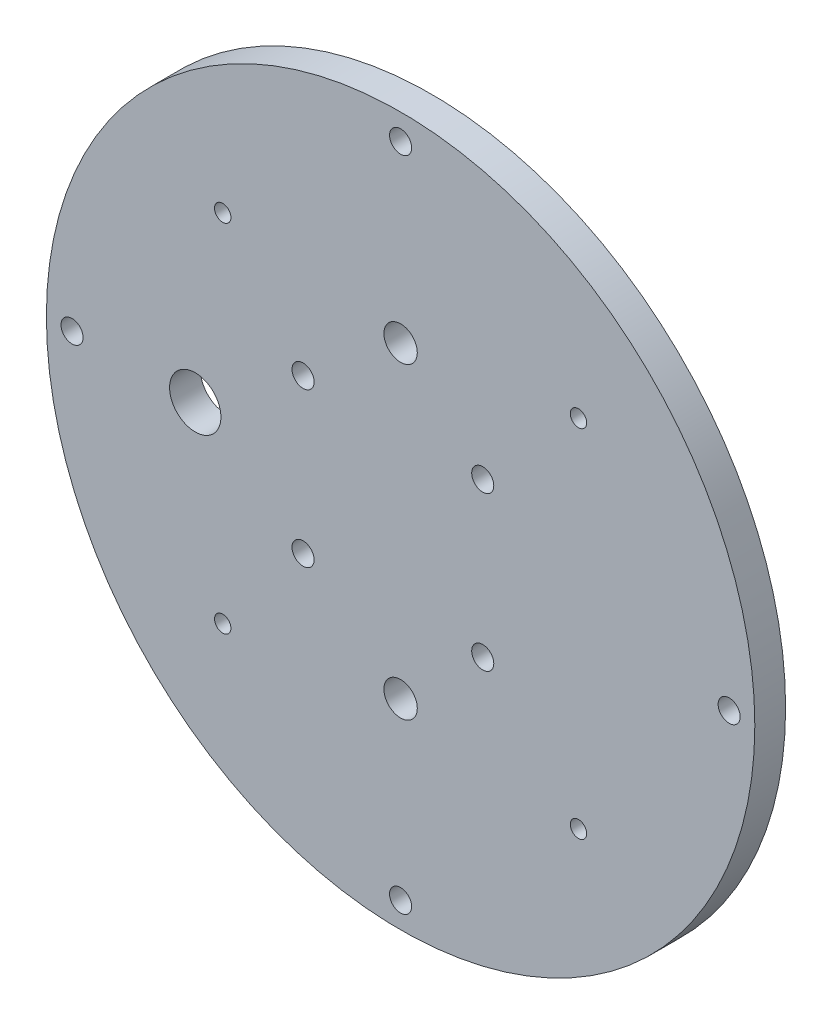
ISO-10303-21;
HEADER;
FILE_DESCRIPTION(('STEP AP214'),'2;1');
FILE_NAME('part.step','',(''),(''),'','','');
FILE_SCHEMA(('AUTOMOTIVE_DESIGN { 1 0 10303 214 1 1 1 1 }'));
ENDSEC;
DATA;
#1=APPLICATION_CONTEXT('core data for automotive mechanical design processes');
#2=APPLICATION_PROTOCOL_DEFINITION('international standard','automotive_design',2000,#1);
#3=PRODUCT_CONTEXT('',#1,'mechanical');
#4=PRODUCT('Part','Part','',(#3));
#5=PRODUCT_RELATED_PRODUCT_CATEGORY('part','',(#4));
#6=PRODUCT_DEFINITION_FORMATION('','',#4);
#7=PRODUCT_DEFINITION_CONTEXT('part definition',#1,'design');
#8=PRODUCT_DEFINITION('design','',#6,#7);
#9=PRODUCT_DEFINITION_SHAPE('','',#8);
#10=(LENGTH_UNIT() NAMED_UNIT(*) SI_UNIT(.MILLI.,.METRE.));
#11=(NAMED_UNIT(*) PLANE_ANGLE_UNIT() SI_UNIT($,.RADIAN.));
#12=(NAMED_UNIT(*) SI_UNIT($,.STERADIAN.) SOLID_ANGLE_UNIT());
#13=UNCERTAINTY_MEASURE_WITH_UNIT(LENGTH_MEASURE(1.E-05),#10,'distance_accuracy_value','');
#14=(GEOMETRIC_REPRESENTATION_CONTEXT(3) GLOBAL_UNCERTAINTY_ASSIGNED_CONTEXT((#13)) GLOBAL_UNIT_ASSIGNED_CONTEXT((#10,
#11,#12)) REPRESENTATION_CONTEXT('',''));
#15=CARTESIAN_POINT('',(0.,0.,0.));
#16=DIRECTION('',(0.,0.,1.));
#17=DIRECTION('',(1.,0.,0.));
#18=AXIS2_PLACEMENT_3D('',#15,#16,#17);
#19=CARTESIAN_POINT('',(0.,0.,6.));
#20=DIRECTION('',(0.,0.,1.));
#21=DIRECTION('',(1.,0.,0.));
#22=AXIS2_PLACEMENT_3D('',#19,#20,#21);
#23=PLANE('',#22);
#24=CARTESIAN_POINT('',(0.,-30.,6.));
#25=DIRECTION('',(0.,0.,1.));
#26=DIRECTION('',(1.,0.,0.));
#27=AXIS2_PLACEMENT_3D('',#24,#25,#26);
#28=CIRCLE('',#27,3.25);
#29=CARTESIAN_POINT('',(3.25,-30.,6.));
#30=VERTEX_POINT('',#29);
#31=EDGE_CURVE('E119',#30,#30,#28,.T.);
#32=ORIENTED_EDGE('',*,*,#31,.F.);
#33=EDGE_LOOP('',(#32));
#34=FACE_BOUND('',#33,.T.);
#35=CARTESIAN_POINT('',(16.,-15.,6.));
#36=DIRECTION('',(0.,0.,1.));
#37=DIRECTION('',(1.,0.,0.));
#38=AXIS2_PLACEMENT_3D('',#35,#36,#37);
#39=CIRCLE('',#38,2.15);
#40=CARTESIAN_POINT('',(18.15,-15.,6.));
#41=VERTEX_POINT('',#40);
#42=EDGE_CURVE('E107',#41,#41,#39,.T.);
#43=ORIENTED_EDGE('',*,*,#42,.F.);
#44=EDGE_LOOP('',(#43));
#45=FACE_BOUND('',#44,.T.);
#46=CARTESIAN_POINT('',(-19.,-15.,6.));
#47=DIRECTION('',(0.,0.,1.));
#48=DIRECTION('',(1.,0.,0.));
#49=AXIS2_PLACEMENT_3D('',#46,#47,#48);
#50=CIRCLE('',#49,2.15);
#51=CARTESIAN_POINT('',(-16.85,-15.,6.));
#52=VERTEX_POINT('',#51);
#53=EDGE_CURVE('E95',#52,#52,#50,.T.);
#54=ORIENTED_EDGE('',*,*,#53,.F.);
#55=EDGE_LOOP('',(#54));
#56=FACE_BOUND('',#55,.T.);
#57=CARTESIAN_POINT('',(0.,-64.,6.));
#58=DIRECTION('',(0.,0.,1.));
#59=DIRECTION('',(1.,0.,0.));
#60=AXIS2_PLACEMENT_3D('',#57,#58,#59);
#61=CIRCLE('',#60,2.15);
#62=CARTESIAN_POINT('',(2.14999999999999,-64.,6.));
#63=VERTEX_POINT('',#62);
#64=EDGE_CURVE('E83',#63,#63,#61,.T.);
#65=ORIENTED_EDGE('',*,*,#64,.F.);
#66=EDGE_LOOP('',(#65));
#67=FACE_BOUND('',#66,.T.);
#68=CARTESIAN_POINT('',(0.,64.,6.));
#69=DIRECTION('',(0.,0.,1.));
#70=DIRECTION('',(1.,0.,0.));
#71=AXIS2_PLACEMENT_3D('',#68,#69,#70);
#72=CIRCLE('',#71,2.15);
#73=CARTESIAN_POINT('',(2.15,64.,6.));
#74=VERTEX_POINT('',#73);
#75=EDGE_CURVE('E71',#74,#74,#72,.T.);
#76=ORIENTED_EDGE('',*,*,#75,.F.);
#77=EDGE_LOOP('',(#76));
#78=FACE_BOUND('',#77,.T.);
#79=CARTESIAN_POINT('',(34.6482322781408,-34.6482322781408,6.));
#80=DIRECTION('',(0.,0.,1.));
#81=DIRECTION('',(1.,0.,0.));
#82=AXIS2_PLACEMENT_3D('',#79,#80,#81);
#83=CIRCLE('',#82,1.6);
#84=CARTESIAN_POINT('',(36.2482322781408,-34.6482322781408,6.));
#85=VERTEX_POINT('',#84);
#86=EDGE_CURVE('E59',#85,#85,#83,.T.);
#87=ORIENTED_EDGE('',*,*,#86,.F.);
#88=EDGE_LOOP('',(#87));
#89=FACE_BOUND('',#88,.T.);
#90=CARTESIAN_POINT('',(-34.6482322781408,34.6482322781408,6.));
#91=DIRECTION('',(0.,0.,1.));
#92=DIRECTION('',(1.,0.,0.));
#93=AXIS2_PLACEMENT_3D('',#90,#91,#92);
#94=CIRCLE('',#93,1.6);
#95=CARTESIAN_POINT('',(-33.0482322781408,34.6482322781408,6.));
#96=VERTEX_POINT('',#95);
#97=EDGE_CURVE('E47',#96,#96,#94,.T.);
#98=ORIENTED_EDGE('',*,*,#97,.F.);
#99=EDGE_LOOP('',(#98));
#100=FACE_BOUND('',#99,.T.);
#101=CARTESIAN_POINT('',(0.,0.,6.));
#102=DIRECTION('',(0.,0.,1.));
#103=DIRECTION('',(1.,0.,0.));
#104=AXIS2_PLACEMENT_3D('',#101,#102,#103);
#105=CIRCLE('',#104,69.);
#106=CARTESIAN_POINT('',(69.,0.,6.));
#107=VERTEX_POINT('',#106);
#108=EDGE_CURVE('E10',#107,#107,#105,.T.);
#109=ORIENTED_EDGE('',*,*,#108,.T.);
#110=EDGE_LOOP('',(#109));
#111=FACE_BOUND('',#110,.T.);
#112=CARTESIAN_POINT('',(34.6482322781408,34.6482322781408,6.));
#113=DIRECTION('',(0.,0.,1.));
#114=DIRECTION('',(1.,0.,0.));
#115=AXIS2_PLACEMENT_3D('',#112,#113,#114);
#116=CIRCLE('',#115,1.6);
#117=CARTESIAN_POINT('',(36.2482322781408,34.6482322781408,6.));
#118=VERTEX_POINT('',#117);
#119=EDGE_CURVE('E42',#118,#118,#116,.T.);
#120=ORIENTED_EDGE('',*,*,#119,.F.);
#121=EDGE_LOOP('',(#120));
#122=FACE_BOUND('',#121,.T.);
#123=CARTESIAN_POINT('',(-34.6482322781408,-34.6482322781408,6.));
#124=DIRECTION('',(0.,0.,1.));
#125=DIRECTION('',(1.,0.,0.));
#126=AXIS2_PLACEMENT_3D('',#123,#124,#125);
#127=CIRCLE('',#126,1.6);
#128=CARTESIAN_POINT('',(-33.0482322781408,-34.6482322781408,6.));
#129=VERTEX_POINT('',#128);
#130=EDGE_CURVE('E53',#129,#129,#127,.T.);
#131=ORIENTED_EDGE('',*,*,#130,.F.);
#132=EDGE_LOOP('',(#131));
#133=FACE_BOUND('',#132,.T.);
#134=CARTESIAN_POINT('',(64.,0.,6.));
#135=DIRECTION('',(0.,0.,1.));
#136=DIRECTION('',(1.,0.,0.));
#137=AXIS2_PLACEMENT_3D('',#134,#135,#136);
#138=CIRCLE('',#137,2.15);
#139=CARTESIAN_POINT('',(66.15,0.,6.));
#140=VERTEX_POINT('',#139);
#141=EDGE_CURVE('E65',#140,#140,#138,.T.);
#142=ORIENTED_EDGE('',*,*,#141,.F.);
#143=EDGE_LOOP('',(#142));
#144=FACE_BOUND('',#143,.T.);
#145=CARTESIAN_POINT('',(-64.,0.,6.));
#146=DIRECTION('',(0.,0.,1.));
#147=DIRECTION('',(1.,0.,0.));
#148=AXIS2_PLACEMENT_3D('',#145,#146,#147);
#149=CIRCLE('',#148,2.15);
#150=CARTESIAN_POINT('',(-61.85,0.,6.));
#151=VERTEX_POINT('',#150);
#152=EDGE_CURVE('E77',#151,#151,#149,.T.);
#153=ORIENTED_EDGE('',*,*,#152,.F.);
#154=EDGE_LOOP('',(#153));
#155=FACE_BOUND('',#154,.T.);
#156=CARTESIAN_POINT('',(-19.,15.,6.));
#157=DIRECTION('',(0.,0.,1.));
#158=DIRECTION('',(1.,0.,0.));
#159=AXIS2_PLACEMENT_3D('',#156,#157,#158);
#160=CIRCLE('',#159,2.15);
#161=CARTESIAN_POINT('',(-16.85,15.,6.));
#162=VERTEX_POINT('',#161);
#163=EDGE_CURVE('E89',#162,#162,#160,.T.);
#164=ORIENTED_EDGE('',*,*,#163,.F.);
#165=EDGE_LOOP('',(#164));
#166=FACE_BOUND('',#165,.T.);
#167=CARTESIAN_POINT('',(16.,15.,6.));
#168=DIRECTION('',(0.,0.,1.));
#169=DIRECTION('',(1.,0.,0.));
#170=AXIS2_PLACEMENT_3D('',#167,#168,#169);
#171=CIRCLE('',#170,2.15);
#172=CARTESIAN_POINT('',(18.15,15.,6.));
#173=VERTEX_POINT('',#172);
#174=EDGE_CURVE('E101',#173,#173,#171,.T.);
#175=ORIENTED_EDGE('',*,*,#174,.F.);
#176=EDGE_LOOP('',(#175));
#177=FACE_BOUND('',#176,.T.);
#178=CARTESIAN_POINT('',(0.,30.,6.));
#179=DIRECTION('',(0.,0.,1.));
#180=DIRECTION('',(1.,0.,0.));
#181=AXIS2_PLACEMENT_3D('',#178,#179,#180);
#182=CIRCLE('',#181,3.25);
#183=CARTESIAN_POINT('',(3.25,30.,6.));
#184=VERTEX_POINT('',#183);
#185=EDGE_CURVE('E113',#184,#184,#182,.T.);
#186=ORIENTED_EDGE('',*,*,#185,.F.);
#187=EDGE_LOOP('',(#186));
#188=FACE_BOUND('',#187,.T.);
#189=CARTESIAN_POINT('',(-40.,0.,6.));
#190=DIRECTION('',(0.,0.,1.));
#191=DIRECTION('',(1.,0.,0.));
#192=AXIS2_PLACEMENT_3D('',#189,#190,#191);
#193=CIRCLE('',#192,5.);
#194=CARTESIAN_POINT('',(-35.,0.,6.));
#195=VERTEX_POINT('',#194);
#196=EDGE_CURVE('E125',#195,#195,#193,.T.);
#197=ORIENTED_EDGE('',*,*,#196,.F.);
#198=EDGE_LOOP('',(#197));
#199=FACE_BOUND('',#198,.T.);
#200=ADVANCED_FACE('F31',(#34,#45,#56,#67,#78,#89,#100,#111,#122,#133,#144,#155,#166,#177,#188,
#199),#23,.T.);
#201=CARTESIAN_POINT('',(0.,0.,0.));
#202=DIRECTION('',(0.,0.,1.));
#203=DIRECTION('',(1.,0.,0.));
#204=AXIS2_PLACEMENT_3D('',#201,#202,#203);
#205=PLANE('',#204);
#206=CARTESIAN_POINT('',(0.,0.,0.));
#207=DIRECTION('',(0.,0.,1.));
#208=DIRECTION('',(1.,0.,0.));
#209=AXIS2_PLACEMENT_3D('',#206,#207,#208);
#210=CIRCLE('',#209,69.);
#211=CARTESIAN_POINT('',(69.,0.,0.));
#212=VERTEX_POINT('',#211);
#213=EDGE_CURVE('E35',#212,#212,#210,.T.);
#214=ORIENTED_EDGE('',*,*,#213,.F.);
#215=EDGE_LOOP('',(#214));
#216=FACE_BOUND('',#215,.T.);
#217=CARTESIAN_POINT('',(34.6482322781408,34.6482322781408,0.));
#218=DIRECTION('',(0.,0.,1.));
#219=DIRECTION('',(1.,0.,0.));
#220=AXIS2_PLACEMENT_3D('',#217,#218,#219);
#221=CIRCLE('',#220,1.6);
#222=CARTESIAN_POINT('',(36.2482322781408,34.6482322781408,0.));
#223=VERTEX_POINT('',#222);
#224=EDGE_CURVE('E44',#223,#223,#221,.T.);
#225=ORIENTED_EDGE('',*,*,#224,.T.);
#226=EDGE_LOOP('',(#225));
#227=FACE_BOUND('',#226,.T.);
#228=CARTESIAN_POINT('',(-34.6482322781408,34.6482322781408,0.));
#229=DIRECTION('',(0.,0.,1.));
#230=DIRECTION('',(1.,0.,0.));
#231=AXIS2_PLACEMENT_3D('',#228,#229,#230);
#232=CIRCLE('',#231,1.6);
#233=CARTESIAN_POINT('',(-33.0482322781408,34.6482322781408,0.));
#234=VERTEX_POINT('',#233);
#235=EDGE_CURVE('E50',#234,#234,#232,.T.);
#236=ORIENTED_EDGE('',*,*,#235,.T.);
#237=EDGE_LOOP('',(#236));
#238=FACE_BOUND('',#237,.T.);
#239=CARTESIAN_POINT('',(-34.6482322781408,-34.6482322781408,0.));
#240=DIRECTION('',(0.,0.,1.));
#241=DIRECTION('',(1.,0.,0.));
#242=AXIS2_PLACEMENT_3D('',#239,#240,#241);
#243=CIRCLE('',#242,1.6);
#244=CARTESIAN_POINT('',(-33.0482322781408,-34.6482322781408,0.));
#245=VERTEX_POINT('',#244);
#246=EDGE_CURVE('E56',#245,#245,#243,.T.);
#247=ORIENTED_EDGE('',*,*,#246,.T.);
#248=EDGE_LOOP('',(#247));
#249=FACE_BOUND('',#248,.T.);
#250=CARTESIAN_POINT('',(34.6482322781408,-34.6482322781408,0.));
#251=DIRECTION('',(0.,0.,1.));
#252=DIRECTION('',(1.,0.,0.));
#253=AXIS2_PLACEMENT_3D('',#250,#251,#252);
#254=CIRCLE('',#253,1.6);
#255=CARTESIAN_POINT('',(36.2482322781408,-34.6482322781408,0.));
#256=VERTEX_POINT('',#255);
#257=EDGE_CURVE('E62',#256,#256,#254,.T.);
#258=ORIENTED_EDGE('',*,*,#257,.T.);
#259=EDGE_LOOP('',(#258));
#260=FACE_BOUND('',#259,.T.);
#261=CARTESIAN_POINT('',(64.,0.,0.));
#262=DIRECTION('',(0.,0.,1.));
#263=DIRECTION('',(1.,0.,0.));
#264=AXIS2_PLACEMENT_3D('',#261,#262,#263);
#265=CIRCLE('',#264,2.15);
#266=CARTESIAN_POINT('',(66.15,0.,0.));
#267=VERTEX_POINT('',#266);
#268=EDGE_CURVE('E68',#267,#267,#265,.T.);
#269=ORIENTED_EDGE('',*,*,#268,.T.);
#270=EDGE_LOOP('',(#269));
#271=FACE_BOUND('',#270,.T.);
#272=CARTESIAN_POINT('',(0.,64.,0.));
#273=DIRECTION('',(0.,0.,1.));
#274=DIRECTION('',(1.,0.,0.));
#275=AXIS2_PLACEMENT_3D('',#272,#273,#274);
#276=CIRCLE('',#275,2.15);
#277=CARTESIAN_POINT('',(2.15,64.,0.));
#278=VERTEX_POINT('',#277);
#279=EDGE_CURVE('E74',#278,#278,#276,.T.);
#280=ORIENTED_EDGE('',*,*,#279,.T.);
#281=EDGE_LOOP('',(#280));
#282=FACE_BOUND('',#281,.T.);
#283=CARTESIAN_POINT('',(-64.,0.,0.));
#284=DIRECTION('',(0.,0.,1.));
#285=DIRECTION('',(1.,0.,0.));
#286=AXIS2_PLACEMENT_3D('',#283,#284,#285);
#287=CIRCLE('',#286,2.15);
#288=CARTESIAN_POINT('',(-61.85,0.,0.));
#289=VERTEX_POINT('',#288);
#290=EDGE_CURVE('E80',#289,#289,#287,.T.);
#291=ORIENTED_EDGE('',*,*,#290,.T.);
#292=EDGE_LOOP('',(#291));
#293=FACE_BOUND('',#292,.T.);
#294=CARTESIAN_POINT('',(0.,-64.,0.));
#295=DIRECTION('',(0.,0.,1.));
#296=DIRECTION('',(1.,0.,0.));
#297=AXIS2_PLACEMENT_3D('',#294,#295,#296);
#298=CIRCLE('',#297,2.15);
#299=CARTESIAN_POINT('',(2.14999999999999,-64.,0.));
#300=VERTEX_POINT('',#299);
#301=EDGE_CURVE('E86',#300,#300,#298,.T.);
#302=ORIENTED_EDGE('',*,*,#301,.T.);
#303=EDGE_LOOP('',(#302));
#304=FACE_BOUND('',#303,.T.);
#305=CARTESIAN_POINT('',(-19.,15.,0.));
#306=DIRECTION('',(0.,0.,1.));
#307=DIRECTION('',(1.,0.,0.));
#308=AXIS2_PLACEMENT_3D('',#305,#306,#307);
#309=CIRCLE('',#308,2.15);
#310=CARTESIAN_POINT('',(-16.85,15.,0.));
#311=VERTEX_POINT('',#310);
#312=EDGE_CURVE('E92',#311,#311,#309,.T.);
#313=ORIENTED_EDGE('',*,*,#312,.T.);
#314=EDGE_LOOP('',(#313));
#315=FACE_BOUND('',#314,.T.);
#316=CARTESIAN_POINT('',(-19.,-15.,0.));
#317=DIRECTION('',(0.,0.,1.));
#318=DIRECTION('',(1.,0.,0.));
#319=AXIS2_PLACEMENT_3D('',#316,#317,#318);
#320=CIRCLE('',#319,2.15);
#321=CARTESIAN_POINT('',(-16.85,-15.,0.));
#322=VERTEX_POINT('',#321);
#323=EDGE_CURVE('E98',#322,#322,#320,.T.);
#324=ORIENTED_EDGE('',*,*,#323,.T.);
#325=EDGE_LOOP('',(#324));
#326=FACE_BOUND('',#325,.T.);
#327=CARTESIAN_POINT('',(16.,15.,0.));
#328=DIRECTION('',(0.,0.,1.));
#329=DIRECTION('',(1.,0.,0.));
#330=AXIS2_PLACEMENT_3D('',#327,#328,#329);
#331=CIRCLE('',#330,2.15);
#332=CARTESIAN_POINT('',(18.15,15.,0.));
#333=VERTEX_POINT('',#332);
#334=EDGE_CURVE('E104',#333,#333,#331,.T.);
#335=ORIENTED_EDGE('',*,*,#334,.T.);
#336=EDGE_LOOP('',(#335));
#337=FACE_BOUND('',#336,.T.);
#338=CARTESIAN_POINT('',(16.,-15.,0.));
#339=DIRECTION('',(0.,0.,1.));
#340=DIRECTION('',(1.,0.,0.));
#341=AXIS2_PLACEMENT_3D('',#338,#339,#340);
#342=CIRCLE('',#341,2.15);
#343=CARTESIAN_POINT('',(18.15,-15.,0.));
#344=VERTEX_POINT('',#343);
#345=EDGE_CURVE('E110',#344,#344,#342,.T.);
#346=ORIENTED_EDGE('',*,*,#345,.T.);
#347=EDGE_LOOP('',(#346));
#348=FACE_BOUND('',#347,.T.);
#349=CARTESIAN_POINT('',(0.,30.,0.));
#350=DIRECTION('',(0.,0.,1.));
#351=DIRECTION('',(1.,0.,0.));
#352=AXIS2_PLACEMENT_3D('',#349,#350,#351);
#353=CIRCLE('',#352,3.25);
#354=CARTESIAN_POINT('',(3.25,30.,0.));
#355=VERTEX_POINT('',#354);
#356=EDGE_CURVE('E116',#355,#355,#353,.T.);
#357=ORIENTED_EDGE('',*,*,#356,.T.);
#358=EDGE_LOOP('',(#357));
#359=FACE_BOUND('',#358,.T.);
#360=CARTESIAN_POINT('',(0.,-30.,0.));
#361=DIRECTION('',(0.,0.,1.));
#362=DIRECTION('',(1.,0.,0.));
#363=AXIS2_PLACEMENT_3D('',#360,#361,#362);
#364=CIRCLE('',#363,3.25);
#365=CARTESIAN_POINT('',(3.25,-30.,0.));
#366=VERTEX_POINT('',#365);
#367=EDGE_CURVE('E122',#366,#366,#364,.T.);
#368=ORIENTED_EDGE('',*,*,#367,.T.);
#369=EDGE_LOOP('',(#368));
#370=FACE_BOUND('',#369,.T.);
#371=CARTESIAN_POINT('',(-40.,0.,0.));
#372=DIRECTION('',(0.,0.,1.));
#373=DIRECTION('',(1.,0.,0.));
#374=AXIS2_PLACEMENT_3D('',#371,#372,#373);
#375=CIRCLE('',#374,5.);
#376=CARTESIAN_POINT('',(-35.,0.,0.));
#377=VERTEX_POINT('',#376);
#378=EDGE_CURVE('E128',#377,#377,#375,.T.);
#379=ORIENTED_EDGE('',*,*,#378,.T.);
#380=EDGE_LOOP('',(#379));
#381=FACE_BOUND('',#380,.T.);
#382=ADVANCED_FACE('F138',(#216,#227,#238,#249,#260,#271,#282,#293,#304,#315,#326,#337,#348,
#359,#370,#381),#205,.F.);
#383=CARTESIAN_POINT('',(0.,0.,6.));
#384=DIRECTION('',(0.,0.,-1.));
#385=DIRECTION('',(-1.,0.,0.));
#386=AXIS2_PLACEMENT_3D('',#383,#384,#385);
#387=CYLINDRICAL_SURFACE('',#386,69.);
#388=ORIENTED_EDGE('',*,*,#108,.F.);
#389=EDGE_LOOP('',(#388));
#390=FACE_BOUND('',#389,.T.);
#391=ORIENTED_EDGE('',*,*,#213,.T.);
#392=EDGE_LOOP('',(#391));
#393=FACE_BOUND('',#392,.T.);
#394=ADVANCED_FACE('F33',(#390,#393),#387,.T.);
#395=CARTESIAN_POINT('',(34.6482322781408,34.6482322781408,6.));
#396=DIRECTION('',(0.,0.,-1.));
#397=DIRECTION('',(-1.,0.,0.));
#398=AXIS2_PLACEMENT_3D('',#395,#396,#397);
#399=CYLINDRICAL_SURFACE('',#398,1.6);
#400=ORIENTED_EDGE('',*,*,#119,.T.);
#401=EDGE_LOOP('',(#400));
#402=FACE_BOUND('',#401,.T.);
#403=ORIENTED_EDGE('',*,*,#224,.F.);
#404=EDGE_LOOP('',(#403));
#405=FACE_BOUND('',#404,.T.);
#406=ADVANCED_FACE('F148',(#402,#405),#399,.F.);
#407=CARTESIAN_POINT('',(-34.6482322781408,34.6482322781408,6.));
#408=DIRECTION('',(0.,0.,-1.));
#409=DIRECTION('',(-1.,0.,0.));
#410=AXIS2_PLACEMENT_3D('',#407,#408,#409);
#411=CYLINDRICAL_SURFACE('',#410,1.6);
#412=ORIENTED_EDGE('',*,*,#97,.T.);
#413=EDGE_LOOP('',(#412));
#414=FACE_BOUND('',#413,.T.);
#415=ORIENTED_EDGE('',*,*,#235,.F.);
#416=EDGE_LOOP('',(#415));
#417=FACE_BOUND('',#416,.T.);
#418=ADVANCED_FACE('F151',(#414,#417),#411,.F.);
#419=CARTESIAN_POINT('',(-34.6482322781408,-34.6482322781408,6.));
#420=DIRECTION('',(0.,0.,-1.));
#421=DIRECTION('',(-1.,0.,0.));
#422=AXIS2_PLACEMENT_3D('',#419,#420,#421);
#423=CYLINDRICAL_SURFACE('',#422,1.6);
#424=ORIENTED_EDGE('',*,*,#130,.T.);
#425=EDGE_LOOP('',(#424));
#426=FACE_BOUND('',#425,.T.);
#427=ORIENTED_EDGE('',*,*,#246,.F.);
#428=EDGE_LOOP('',(#427));
#429=FACE_BOUND('',#428,.T.);
#430=ADVANCED_FACE('F155',(#426,#429),#423,.F.);
#431=CARTESIAN_POINT('',(34.6482322781408,-34.6482322781408,6.));
#432=DIRECTION('',(0.,0.,-1.));
#433=DIRECTION('',(-1.,0.,0.));
#434=AXIS2_PLACEMENT_3D('',#431,#432,#433);
#435=CYLINDRICAL_SURFACE('',#434,1.6);
#436=ORIENTED_EDGE('',*,*,#86,.T.);
#437=EDGE_LOOP('',(#436));
#438=FACE_BOUND('',#437,.T.);
#439=ORIENTED_EDGE('',*,*,#257,.F.);
#440=EDGE_LOOP('',(#439));
#441=FACE_BOUND('',#440,.T.);
#442=ADVANCED_FACE('F159',(#438,#441),#435,.F.);
#443=CARTESIAN_POINT('',(64.,0.,6.));
#444=DIRECTION('',(0.,0.,-1.));
#445=DIRECTION('',(-1.,0.,0.));
#446=AXIS2_PLACEMENT_3D('',#443,#444,#445);
#447=CYLINDRICAL_SURFACE('',#446,2.15);
#448=ORIENTED_EDGE('',*,*,#141,.T.);
#449=EDGE_LOOP('',(#448));
#450=FACE_BOUND('',#449,.T.);
#451=ORIENTED_EDGE('',*,*,#268,.F.);
#452=EDGE_LOOP('',(#451));
#453=FACE_BOUND('',#452,.T.);
#454=ADVANCED_FACE('F163',(#450,#453),#447,.F.);
#455=CARTESIAN_POINT('',(0.,64.,6.));
#456=DIRECTION('',(0.,0.,-1.));
#457=DIRECTION('',(-1.,0.,0.));
#458=AXIS2_PLACEMENT_3D('',#455,#456,#457);
#459=CYLINDRICAL_SURFACE('',#458,2.15);
#460=ORIENTED_EDGE('',*,*,#75,.T.);
#461=EDGE_LOOP('',(#460));
#462=FACE_BOUND('',#461,.T.);
#463=ORIENTED_EDGE('',*,*,#279,.F.);
#464=EDGE_LOOP('',(#463));
#465=FACE_BOUND('',#464,.T.);
#466=ADVANCED_FACE('F167',(#462,#465),#459,.F.);
#467=CARTESIAN_POINT('',(-64.,0.,6.));
#468=DIRECTION('',(0.,0.,-1.));
#469=DIRECTION('',(-1.,0.,0.));
#470=AXIS2_PLACEMENT_3D('',#467,#468,#469);
#471=CYLINDRICAL_SURFACE('',#470,2.15);
#472=ORIENTED_EDGE('',*,*,#152,.T.);
#473=EDGE_LOOP('',(#472));
#474=FACE_BOUND('',#473,.T.);
#475=ORIENTED_EDGE('',*,*,#290,.F.);
#476=EDGE_LOOP('',(#475));
#477=FACE_BOUND('',#476,.T.);
#478=ADVANCED_FACE('F171',(#474,#477),#471,.F.);
#479=CARTESIAN_POINT('',(0.,-64.,6.));
#480=DIRECTION('',(0.,0.,-1.));
#481=DIRECTION('',(-1.,0.,0.));
#482=AXIS2_PLACEMENT_3D('',#479,#480,#481);
#483=CYLINDRICAL_SURFACE('',#482,2.15);
#484=ORIENTED_EDGE('',*,*,#64,.T.);
#485=EDGE_LOOP('',(#484));
#486=FACE_BOUND('',#485,.T.);
#487=ORIENTED_EDGE('',*,*,#301,.F.);
#488=EDGE_LOOP('',(#487));
#489=FACE_BOUND('',#488,.T.);
#490=ADVANCED_FACE('F175',(#486,#489),#483,.F.);
#491=CARTESIAN_POINT('',(-19.,15.,6.));
#492=DIRECTION('',(0.,0.,-1.));
#493=DIRECTION('',(-1.,0.,0.));
#494=AXIS2_PLACEMENT_3D('',#491,#492,#493);
#495=CYLINDRICAL_SURFACE('',#494,2.15);
#496=ORIENTED_EDGE('',*,*,#163,.T.);
#497=EDGE_LOOP('',(#496));
#498=FACE_BOUND('',#497,.T.);
#499=ORIENTED_EDGE('',*,*,#312,.F.);
#500=EDGE_LOOP('',(#499));
#501=FACE_BOUND('',#500,.T.);
#502=ADVANCED_FACE('F179',(#498,#501),#495,.F.);
#503=CARTESIAN_POINT('',(-19.,-15.,6.));
#504=DIRECTION('',(0.,0.,-1.));
#505=DIRECTION('',(-1.,0.,0.));
#506=AXIS2_PLACEMENT_3D('',#503,#504,#505);
#507=CYLINDRICAL_SURFACE('',#506,2.15);
#508=ORIENTED_EDGE('',*,*,#53,.T.);
#509=EDGE_LOOP('',(#508));
#510=FACE_BOUND('',#509,.T.);
#511=ORIENTED_EDGE('',*,*,#323,.F.);
#512=EDGE_LOOP('',(#511));
#513=FACE_BOUND('',#512,.T.);
#514=ADVANCED_FACE('F183',(#510,#513),#507,.F.);
#515=CARTESIAN_POINT('',(16.,15.,6.));
#516=DIRECTION('',(0.,0.,-1.));
#517=DIRECTION('',(-1.,0.,0.));
#518=AXIS2_PLACEMENT_3D('',#515,#516,#517);
#519=CYLINDRICAL_SURFACE('',#518,2.15);
#520=ORIENTED_EDGE('',*,*,#174,.T.);
#521=EDGE_LOOP('',(#520));
#522=FACE_BOUND('',#521,.T.);
#523=ORIENTED_EDGE('',*,*,#334,.F.);
#524=EDGE_LOOP('',(#523));
#525=FACE_BOUND('',#524,.T.);
#526=ADVANCED_FACE('F187',(#522,#525),#519,.F.);
#527=CARTESIAN_POINT('',(16.,-15.,6.));
#528=DIRECTION('',(0.,0.,-1.));
#529=DIRECTION('',(-1.,0.,0.));
#530=AXIS2_PLACEMENT_3D('',#527,#528,#529);
#531=CYLINDRICAL_SURFACE('',#530,2.15);
#532=ORIENTED_EDGE('',*,*,#42,.T.);
#533=EDGE_LOOP('',(#532));
#534=FACE_BOUND('',#533,.T.);
#535=ORIENTED_EDGE('',*,*,#345,.F.);
#536=EDGE_LOOP('',(#535));
#537=FACE_BOUND('',#536,.T.);
#538=ADVANCED_FACE('F191',(#534,#537),#531,.F.);
#539=CARTESIAN_POINT('',(0.,30.,6.));
#540=DIRECTION('',(0.,0.,-1.));
#541=DIRECTION('',(-1.,0.,0.));
#542=AXIS2_PLACEMENT_3D('',#539,#540,#541);
#543=CYLINDRICAL_SURFACE('',#542,3.25);
#544=ORIENTED_EDGE('',*,*,#185,.T.);
#545=EDGE_LOOP('',(#544));
#546=FACE_BOUND('',#545,.T.);
#547=ORIENTED_EDGE('',*,*,#356,.F.);
#548=EDGE_LOOP('',(#547));
#549=FACE_BOUND('',#548,.T.);
#550=ADVANCED_FACE('F195',(#546,#549),#543,.F.);
#551=CARTESIAN_POINT('',(0.,-30.,6.));
#552=DIRECTION('',(0.,0.,-1.));
#553=DIRECTION('',(-1.,0.,0.));
#554=AXIS2_PLACEMENT_3D('',#551,#552,#553);
#555=CYLINDRICAL_SURFACE('',#554,3.25);
#556=ORIENTED_EDGE('',*,*,#31,.T.);
#557=EDGE_LOOP('',(#556));
#558=FACE_BOUND('',#557,.T.);
#559=ORIENTED_EDGE('',*,*,#367,.F.);
#560=EDGE_LOOP('',(#559));
#561=FACE_BOUND('',#560,.T.);
#562=ADVANCED_FACE('F199',(#558,#561),#555,.F.);
#563=CARTESIAN_POINT('',(-40.,0.,6.));
#564=DIRECTION('',(0.,0.,-1.));
#565=DIRECTION('',(-1.,0.,0.));
#566=AXIS2_PLACEMENT_3D('',#563,#564,#565);
#567=CYLINDRICAL_SURFACE('',#566,5.);
#568=ORIENTED_EDGE('',*,*,#196,.T.);
#569=EDGE_LOOP('',(#568));
#570=FACE_BOUND('',#569,.T.);
#571=ORIENTED_EDGE('',*,*,#378,.F.);
#572=EDGE_LOOP('',(#571));
#573=FACE_BOUND('',#572,.T.);
#574=ADVANCED_FACE('F134',(#570,#573),#567,.F.);
#575=CLOSED_SHELL('',(#200,#382,#394,#406,#418,#430,#442,#454,#466,#478,#490,#502,#514,#526,
#538,#550,#562,#574));
#576=MANIFOLD_SOLID_BREP('B2',#575);
#577=ADVANCED_BREP_SHAPE_REPRESENTATION('',(#18,#576),#14);
#578=SHAPE_DEFINITION_REPRESENTATION(#9,#577);
ENDSEC;
END-ISO-10303-21;
